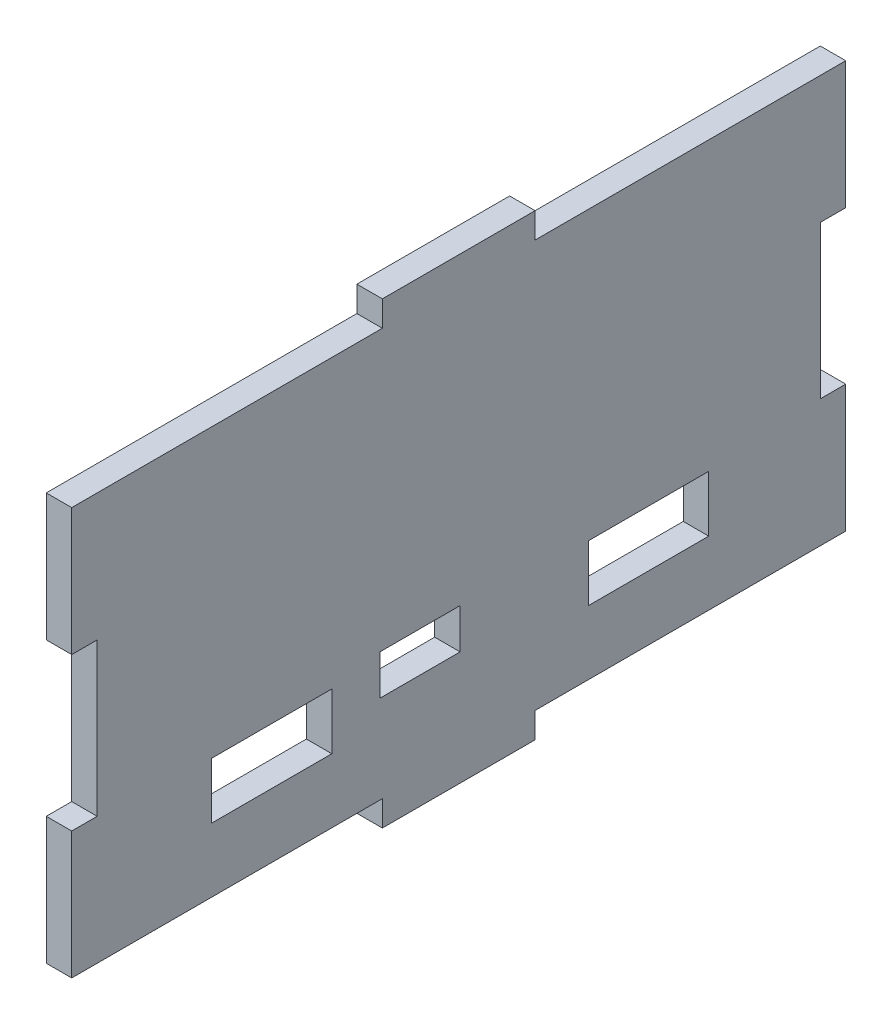
ISO-10303-21;
HEADER;
FILE_DESCRIPTION(('STEP AP214'),'2;1');
FILE_NAME('part.step','',(''),(''),'','','');
FILE_SCHEMA(('AUTOMOTIVE_DESIGN { 1 0 10303 214 1 1 1 1 }'));
ENDSEC;
DATA;
#1=APPLICATION_CONTEXT('core data for automotive mechanical design processes');
#2=APPLICATION_PROTOCOL_DEFINITION('international standard','automotive_design',2000,#1);
#3=PRODUCT_CONTEXT('',#1,'mechanical');
#4=PRODUCT('Part','Part','',(#3));
#5=PRODUCT_RELATED_PRODUCT_CATEGORY('part','',(#4));
#6=PRODUCT_DEFINITION_FORMATION('','',#4);
#7=PRODUCT_DEFINITION_CONTEXT('part definition',#1,'design');
#8=PRODUCT_DEFINITION('design','',#6,#7);
#9=PRODUCT_DEFINITION_SHAPE('','',#8);
#10=(LENGTH_UNIT() NAMED_UNIT(*) SI_UNIT(.MILLI.,.METRE.));
#11=(NAMED_UNIT(*) PLANE_ANGLE_UNIT() SI_UNIT($,.RADIAN.));
#12=(NAMED_UNIT(*) SI_UNIT($,.STERADIAN.) SOLID_ANGLE_UNIT());
#13=UNCERTAINTY_MEASURE_WITH_UNIT(LENGTH_MEASURE(1.E-05),#10,'distance_accuracy_value','');
#14=(GEOMETRIC_REPRESENTATION_CONTEXT(3) GLOBAL_UNCERTAINTY_ASSIGNED_CONTEXT((#13)) GLOBAL_UNIT_ASSIGNED_CONTEXT((#10,
#11,#12)) REPRESENTATION_CONTEXT('',''));
#15=CARTESIAN_POINT('',(0.,0.,0.));
#16=DIRECTION('',(0.,0.,1.));
#17=DIRECTION('',(1.,0.,0.));
#18=AXIS2_PLACEMENT_3D('',#15,#16,#17);
#19=CARTESIAN_POINT('',(3.175,0.,0.));
#20=DIRECTION('',(1.,0.,0.));
#21=DIRECTION('',(0.,0.,-1.));
#22=AXIS2_PLACEMENT_3D('',#19,#20,#21);
#23=PLANE('',#22);
#24=DIRECTION('',(0.,-1.,0.));
#25=VECTOR('',#24,1.);
#26=CARTESIAN_POINT('',(3.175,0.,0.));
#27=LINE('',#26,#25);
#28=CARTESIAN_POINT('',(3.175,15.875,0.));
#29=VERTEX_POINT('',#28);
#30=CARTESIAN_POINT('',(3.175,0.,0.));
#31=VERTEX_POINT('',#30);
#32=EDGE_CURVE('E342',#29,#31,#27,.T.);
#33=ORIENTED_EDGE('',*,*,#32,.T.);
#34=DIRECTION('',(0.,0.,-1.));
#35=VECTOR('',#34,1.);
#36=CARTESIAN_POINT('',(3.175,0.,0.));
#37=LINE('',#36,#35);
#38=CARTESIAN_POINT('',(3.175,0.,-38.735));
#39=VERTEX_POINT('',#38);
#40=EDGE_CURVE('E345',#31,#39,#37,.T.);
#41=ORIENTED_EDGE('',*,*,#40,.T.);
#42=DIRECTION('',(0.,-1.,0.));
#43=VECTOR('',#42,1.);
#44=CARTESIAN_POINT('',(3.175,0.,-38.735));
#45=LINE('',#44,#43);
#46=CARTESIAN_POINT('',(3.175,-3.175,-38.735));
#47=VERTEX_POINT('',#46);
#48=EDGE_CURVE('E348',#39,#47,#45,.T.);
#49=ORIENTED_EDGE('',*,*,#48,.T.);
#50=DIRECTION('',(0.,0.,-1.));
#51=VECTOR('',#50,1.);
#52=CARTESIAN_POINT('',(3.175,-3.175,-38.735));
#53=LINE('',#52,#51);
#54=CARTESIAN_POINT('',(3.175,-3.175,-57.785));
#55=VERTEX_POINT('',#54);
#56=EDGE_CURVE('E350',#47,#55,#53,.T.);
#57=ORIENTED_EDGE('',*,*,#56,.T.);
#58=DIRECTION('',(0.,1.,0.));
#59=VECTOR('',#58,1.);
#60=CARTESIAN_POINT('',(3.175,-3.175,-57.785));
#61=LINE('',#60,#59);
#62=CARTESIAN_POINT('',(3.175,0.,-57.785));
#63=VERTEX_POINT('',#62);
#64=EDGE_CURVE('E352',#55,#63,#61,.T.);
#65=ORIENTED_EDGE('',*,*,#64,.T.);
#66=DIRECTION('',(0.,0.,-1.));
#67=VECTOR('',#66,1.);
#68=CARTESIAN_POINT('',(3.175,0.,-57.785));
#69=LINE('',#68,#67);
#70=CARTESIAN_POINT('',(3.175,0.,-96.52));
#71=VERTEX_POINT('',#70);
#72=EDGE_CURVE('E354',#63,#71,#69,.T.);
#73=ORIENTED_EDGE('',*,*,#72,.T.);
#74=DIRECTION('',(0.,1.,0.));
#75=VECTOR('',#74,1.);
#76=CARTESIAN_POINT('',(3.175,0.,-96.52));
#77=LINE('',#76,#75);
#78=CARTESIAN_POINT('',(3.175,15.875,-96.52));
#79=VERTEX_POINT('',#78);
#80=EDGE_CURVE('E356',#71,#79,#77,.T.);
#81=ORIENTED_EDGE('',*,*,#80,.T.);
#82=DIRECTION('',(0.,0.,1.));
#83=VECTOR('',#82,1.);
#84=CARTESIAN_POINT('',(3.175,15.875,-93.345));
#85=LINE('',#84,#83);
#86=CARTESIAN_POINT('',(3.175,15.875,-93.345));
#87=VERTEX_POINT('',#86);
#88=EDGE_CURVE('E358',#79,#87,#85,.T.);
#89=ORIENTED_EDGE('',*,*,#88,.T.);
#90=DIRECTION('',(0.,1.,0.));
#91=VECTOR('',#90,1.);
#92=CARTESIAN_POINT('',(3.175,34.925,-93.345));
#93=LINE('',#92,#91);
#94=CARTESIAN_POINT('',(3.175,34.925,-93.345));
#95=VERTEX_POINT('',#94);
#96=EDGE_CURVE('E360',#87,#95,#93,.T.);
#97=ORIENTED_EDGE('',*,*,#96,.T.);
#98=DIRECTION('',(0.,0.,-1.));
#99=VECTOR('',#98,1.);
#100=CARTESIAN_POINT('',(3.175,34.925,-96.52));
#101=LINE('',#100,#99);
#102=CARTESIAN_POINT('',(3.175,34.925,-96.52));
#103=VERTEX_POINT('',#102);
#104=EDGE_CURVE('E362',#95,#103,#101,.T.);
#105=ORIENTED_EDGE('',*,*,#104,.T.);
#106=DIRECTION('',(0.,1.,0.));
#107=VECTOR('',#106,1.);
#108=CARTESIAN_POINT('',(3.175,34.925,-96.52));
#109=LINE('',#108,#107);
#110=CARTESIAN_POINT('',(3.175,50.8,-96.52));
#111=VERTEX_POINT('',#110);
#112=EDGE_CURVE('E364',#103,#111,#109,.T.);
#113=ORIENTED_EDGE('',*,*,#112,.T.);
#114=DIRECTION('',(0.,0.,1.));
#115=VECTOR('',#114,1.);
#116=CARTESIAN_POINT('',(3.175,50.8,-57.785));
#117=LINE('',#116,#115);
#118=CARTESIAN_POINT('',(3.175,50.8,-57.785));
#119=VERTEX_POINT('',#118);
#120=EDGE_CURVE('E366',#111,#119,#117,.T.);
#121=ORIENTED_EDGE('',*,*,#120,.T.);
#122=DIRECTION('',(0.,1.,0.));
#123=VECTOR('',#122,1.);
#124=CARTESIAN_POINT('',(3.175,53.975,-57.785));
#125=LINE('',#124,#123);
#126=CARTESIAN_POINT('',(3.175,53.975,-57.785));
#127=VERTEX_POINT('',#126);
#128=EDGE_CURVE('E368',#119,#127,#125,.T.);
#129=ORIENTED_EDGE('',*,*,#128,.T.);
#130=DIRECTION('',(0.,0.,1.));
#131=VECTOR('',#130,1.);
#132=CARTESIAN_POINT('',(3.175,53.975,-38.735));
#133=LINE('',#132,#131);
#134=CARTESIAN_POINT('',(3.175,53.975,-38.735));
#135=VERTEX_POINT('',#134);
#136=EDGE_CURVE('E370',#127,#135,#133,.T.);
#137=ORIENTED_EDGE('',*,*,#136,.T.);
#138=DIRECTION('',(0.,-1.,0.));
#139=VECTOR('',#138,1.);
#140=CARTESIAN_POINT('',(3.175,50.8,-38.735));
#141=LINE('',#140,#139);
#142=CARTESIAN_POINT('',(3.175,50.8,-38.735));
#143=VERTEX_POINT('',#142);
#144=EDGE_CURVE('E372',#135,#143,#141,.T.);
#145=ORIENTED_EDGE('',*,*,#144,.T.);
#146=DIRECTION('',(0.,0.,1.));
#147=VECTOR('',#146,1.);
#148=CARTESIAN_POINT('',(3.175,50.8,0.));
#149=LINE('',#148,#147);
#150=CARTESIAN_POINT('',(3.175,50.8,0.));
#151=VERTEX_POINT('',#150);
#152=EDGE_CURVE('E374',#143,#151,#149,.T.);
#153=ORIENTED_EDGE('',*,*,#152,.T.);
#154=DIRECTION('',(0.,-1.,0.));
#155=VECTOR('',#154,1.);
#156=CARTESIAN_POINT('',(3.175,34.925,0.));
#157=LINE('',#156,#155);
#158=CARTESIAN_POINT('',(3.175,34.925,0.));
#159=VERTEX_POINT('',#158);
#160=EDGE_CURVE('E376',#151,#159,#157,.T.);
#161=ORIENTED_EDGE('',*,*,#160,.T.);
#162=DIRECTION('',(0.,0.,-1.));
#163=VECTOR('',#162,1.);
#164=CARTESIAN_POINT('',(3.175,34.925,0.));
#165=LINE('',#164,#163);
#166=CARTESIAN_POINT('',(3.175,34.925,-3.175));
#167=VERTEX_POINT('',#166);
#168=EDGE_CURVE('E378',#159,#167,#165,.T.);
#169=ORIENTED_EDGE('',*,*,#168,.T.);
#170=DIRECTION('',(0.,-1.,0.));
#171=VECTOR('',#170,1.);
#172=CARTESIAN_POINT('',(3.175,34.925,-3.175));
#173=LINE('',#172,#171);
#174=CARTESIAN_POINT('',(3.175,15.875,-3.175));
#175=VERTEX_POINT('',#174);
#176=EDGE_CURVE('E380',#167,#175,#173,.T.);
#177=ORIENTED_EDGE('',*,*,#176,.T.);
#178=DIRECTION('',(0.,0.,1.));
#179=VECTOR('',#178,1.);
#180=CARTESIAN_POINT('',(3.175,15.875,-3.175));
#181=LINE('',#180,#179);
#182=EDGE_CURVE('E382',#175,#29,#181,.T.);
#183=ORIENTED_EDGE('',*,*,#182,.T.);
#184=EDGE_LOOP('',(#33,#41,#49,#57,#65,#73,#81,#89,#97,#105,#113,#121,#129,#137,#145,#153,#161,
#169,#177,#183));
#185=FACE_BOUND('',#184,.T.);
#186=DIRECTION('',(0.,1.,0.));
#187=VECTOR('',#186,1.);
#188=CARTESIAN_POINT('',(3.175,15.,-32.4354385027087));
#189=LINE('',#188,#187);
#190=CARTESIAN_POINT('',(3.175,8.,-32.4354385027087));
#191=VERTEX_POINT('',#190);
#192=CARTESIAN_POINT('',(3.175,15.,-32.4354385027087));
#193=VERTEX_POINT('',#192);
#194=EDGE_CURVE('E313',#191,#193,#189,.T.);
#195=ORIENTED_EDGE('',*,*,#194,.F.);
#196=DIRECTION('',(0.,0.,-1.));
#197=VECTOR('',#196,1.);
#198=CARTESIAN_POINT('',(3.175,8.,-32.4354385027087));
#199=LINE('',#198,#197);
#200=CARTESIAN_POINT('',(3.175,8.,-17.4354385027087));
#201=VERTEX_POINT('',#200);
#202=EDGE_CURVE('E311',#201,#191,#199,.T.);
#203=ORIENTED_EDGE('',*,*,#202,.F.);
#204=DIRECTION('',(0.,-1.,0.));
#205=VECTOR('',#204,1.);
#206=CARTESIAN_POINT('',(3.175,8.,-17.4354385027087));
#207=LINE('',#206,#205);
#208=CARTESIAN_POINT('',(3.175,15.,-17.4354385027087));
#209=VERTEX_POINT('',#208);
#210=EDGE_CURVE('E319',#209,#201,#207,.T.);
#211=ORIENTED_EDGE('',*,*,#210,.F.);
#212=DIRECTION('',(0.,0.,1.));
#213=VECTOR('',#212,1.);
#214=CARTESIAN_POINT('',(3.175,15.,-17.4354385027087));
#215=LINE('',#214,#213);
#216=EDGE_CURVE('E316',#193,#209,#215,.T.);
#217=ORIENTED_EDGE('',*,*,#216,.F.);
#218=EDGE_LOOP('',(#195,#203,#211,#217));
#219=FACE_BOUND('',#218,.T.);
#220=DIRECTION('',(0.,0.,-1.));
#221=VECTOR('',#220,1.);
#222=CARTESIAN_POINT('',(3.175,11.,-38.4354385027087));
#223=LINE('',#222,#221);
#224=CARTESIAN_POINT('',(3.175,11.,-38.4354385027087));
#225=VERTEX_POINT('',#224);
#226=CARTESIAN_POINT('',(3.175,11.,-48.4354385027087));
#227=VERTEX_POINT('',#226);
#228=EDGE_CURVE('E282',#225,#227,#223,.T.);
#229=ORIENTED_EDGE('',*,*,#228,.F.);
#230=DIRECTION('',(0.,-1.,0.));
#231=VECTOR('',#230,1.);
#232=CARTESIAN_POINT('',(3.175,11.,-38.4354385027087));
#233=LINE('',#232,#231);
#234=CARTESIAN_POINT('',(3.175,16.,-38.4354385027087));
#235=VERTEX_POINT('',#234);
#236=EDGE_CURVE('E280',#235,#225,#233,.T.);
#237=ORIENTED_EDGE('',*,*,#236,.F.);
#238=DIRECTION('',(0.,0.,1.));
#239=VECTOR('',#238,1.);
#240=CARTESIAN_POINT('',(3.175,16.,-38.4354385027087));
#241=LINE('',#240,#239);
#242=CARTESIAN_POINT('',(3.175,16.,-48.4354385027087));
#243=VERTEX_POINT('',#242);
#244=EDGE_CURVE('E288',#243,#235,#241,.T.);
#245=ORIENTED_EDGE('',*,*,#244,.F.);
#246=DIRECTION('',(0.,1.,0.));
#247=VECTOR('',#246,1.);
#248=CARTESIAN_POINT('',(3.175,11.,-48.4354385027087));
#249=LINE('',#248,#247);
#250=EDGE_CURVE('E285',#227,#243,#249,.T.);
#251=ORIENTED_EDGE('',*,*,#250,.F.);
#252=EDGE_LOOP('',(#229,#237,#245,#251));
#253=FACE_BOUND('',#252,.T.);
#254=DIRECTION('',(0.,0.,-1.));
#255=VECTOR('',#254,1.);
#256=CARTESIAN_POINT('',(3.175,8.,-64.4354385027087));
#257=LINE('',#256,#255);
#258=CARTESIAN_POINT('',(3.175,8.,-64.4354385027087));
#259=VERTEX_POINT('',#258);
#260=CARTESIAN_POINT('',(3.175,8.,-79.4354385027087));
#261=VERTEX_POINT('',#260);
#262=EDGE_CURVE('E252',#259,#261,#257,.T.);
#263=ORIENTED_EDGE('',*,*,#262,.F.);
#264=DIRECTION('',(0.,-1.,0.));
#265=VECTOR('',#264,1.);
#266=CARTESIAN_POINT('',(3.175,8.,-64.4354385027087));
#267=LINE('',#266,#265);
#268=CARTESIAN_POINT('',(3.175,15.,-64.4354385027087));
#269=VERTEX_POINT('',#268);
#270=EDGE_CURVE('E244',#269,#259,#267,.T.);
#271=ORIENTED_EDGE('',*,*,#270,.F.);
#272=DIRECTION('',(0.,0.,1.));
#273=VECTOR('',#272,1.);
#274=CARTESIAN_POINT('',(3.175,15.,-64.4354385027087));
#275=LINE('',#274,#273);
#276=CARTESIAN_POINT('',(3.175,15.,-79.4354385027087));
#277=VERTEX_POINT('',#276);
#278=EDGE_CURVE('E266',#277,#269,#275,.T.);
#279=ORIENTED_EDGE('',*,*,#278,.F.);
#280=DIRECTION('',(0.,1.,0.));
#281=VECTOR('',#280,1.);
#282=CARTESIAN_POINT('',(3.175,8.,-79.4354385027087));
#283=LINE('',#282,#281);
#284=EDGE_CURVE('E264',#261,#277,#283,.T.);
#285=ORIENTED_EDGE('',*,*,#284,.F.);
#286=EDGE_LOOP('',(#263,#271,#279,#285));
#287=FACE_BOUND('',#286,.T.);
#288=ADVANCED_FACE('F35',(#185,#219,#253,#287),#23,.T.);
#289=CARTESIAN_POINT('',(0.,0.,0.));
#290=DIRECTION('',(1.,0.,0.));
#291=DIRECTION('',(0.,0.,-1.));
#292=AXIS2_PLACEMENT_3D('',#289,#290,#291);
#293=PLANE('',#292);
#294=DIRECTION('',(0.,-1.,0.));
#295=VECTOR('',#294,1.);
#296=CARTESIAN_POINT('',(0.,11.,-38.4354385027087));
#297=LINE('',#296,#295);
#298=CARTESIAN_POINT('',(0.,16.,-38.4354385027087));
#299=VERTEX_POINT('',#298);
#300=CARTESIAN_POINT('',(0.,11.,-38.4354385027087));
#301=VERTEX_POINT('',#300);
#302=EDGE_CURVE('E260',#299,#301,#297,.T.);
#303=ORIENTED_EDGE('',*,*,#302,.T.);
#304=DIRECTION('',(0.,0.,-1.));
#305=VECTOR('',#304,1.);
#306=CARTESIAN_POINT('',(0.,11.,-38.4354385027087));
#307=LINE('',#306,#305);
#308=CARTESIAN_POINT('',(0.,11.,-48.4354385027087));
#309=VERTEX_POINT('',#308);
#310=EDGE_CURVE('E293',#301,#309,#307,.T.);
#311=ORIENTED_EDGE('',*,*,#310,.T.);
#312=DIRECTION('',(0.,1.,0.));
#313=VECTOR('',#312,1.);
#314=CARTESIAN_POINT('',(0.,11.,-48.4354385027087));
#315=LINE('',#314,#313);
#316=CARTESIAN_POINT('',(0.,16.,-48.4354385027087));
#317=VERTEX_POINT('',#316);
#318=EDGE_CURVE('E296',#309,#317,#315,.T.);
#319=ORIENTED_EDGE('',*,*,#318,.T.);
#320=DIRECTION('',(0.,0.,1.));
#321=VECTOR('',#320,1.);
#322=CARTESIAN_POINT('',(0.,16.,-38.4354385027087));
#323=LINE('',#322,#321);
#324=EDGE_CURVE('E283',#317,#299,#323,.T.);
#325=ORIENTED_EDGE('',*,*,#324,.T.);
#326=EDGE_LOOP('',(#303,#311,#319,#325));
#327=FACE_BOUND('',#326,.T.);
#328=DIRECTION('',(0.,-1.,0.));
#329=VECTOR('',#328,1.);
#330=CARTESIAN_POINT('',(0.,0.,0.));
#331=LINE('',#330,#329);
#332=CARTESIAN_POINT('',(0.,15.875,0.));
#333=VERTEX_POINT('',#332);
#334=CARTESIAN_POINT('',(0.,0.,0.));
#335=VERTEX_POINT('',#334);
#336=EDGE_CURVE('E341',#333,#335,#331,.T.);
#337=ORIENTED_EDGE('',*,*,#336,.F.);
#338=DIRECTION('',(0.,0.,1.));
#339=VECTOR('',#338,1.);
#340=CARTESIAN_POINT('',(0.,15.875,-3.175));
#341=LINE('',#340,#339);
#342=CARTESIAN_POINT('',(0.,15.875,-3.175));
#343=VERTEX_POINT('',#342);
#344=EDGE_CURVE('E346',#343,#333,#341,.T.);
#345=ORIENTED_EDGE('',*,*,#344,.F.);
#346=DIRECTION('',(0.,-1.,0.));
#347=VECTOR('',#346,1.);
#348=CARTESIAN_POINT('',(0.,34.925,-3.175));
#349=LINE('',#348,#347);
#350=CARTESIAN_POINT('',(0.,34.925,-3.175));
#351=VERTEX_POINT('',#350);
#352=EDGE_CURVE('E421',#351,#343,#349,.T.);
#353=ORIENTED_EDGE('',*,*,#352,.F.);
#354=DIRECTION('',(0.,0.,-1.));
#355=VECTOR('',#354,1.);
#356=CARTESIAN_POINT('',(0.,34.925,0.));
#357=LINE('',#356,#355);
#358=CARTESIAN_POINT('',(0.,34.925,0.));
#359=VERTEX_POINT('',#358);
#360=EDGE_CURVE('E419',#359,#351,#357,.T.);
#361=ORIENTED_EDGE('',*,*,#360,.F.);
#362=DIRECTION('',(0.,-1.,0.));
#363=VECTOR('',#362,1.);
#364=CARTESIAN_POINT('',(0.,34.925,0.));
#365=LINE('',#364,#363);
#366=CARTESIAN_POINT('',(0.,50.8,0.));
#367=VERTEX_POINT('',#366);
#368=EDGE_CURVE('E417',#367,#359,#365,.T.);
#369=ORIENTED_EDGE('',*,*,#368,.F.);
#370=DIRECTION('',(0.,0.,1.));
#371=VECTOR('',#370,1.);
#372=CARTESIAN_POINT('',(0.,50.8,0.));
#373=LINE('',#372,#371);
#374=CARTESIAN_POINT('',(0.,50.8,-38.735));
#375=VERTEX_POINT('',#374);
#376=EDGE_CURVE('E415',#375,#367,#373,.T.);
#377=ORIENTED_EDGE('',*,*,#376,.F.);
#378=DIRECTION('',(0.,-1.,0.));
#379=VECTOR('',#378,1.);
#380=CARTESIAN_POINT('',(0.,50.8,-38.735));
#381=LINE('',#380,#379);
#382=CARTESIAN_POINT('',(0.,53.975,-38.735));
#383=VERTEX_POINT('',#382);
#384=EDGE_CURVE('E413',#383,#375,#381,.T.);
#385=ORIENTED_EDGE('',*,*,#384,.F.);
#386=DIRECTION('',(0.,0.,1.));
#387=VECTOR('',#386,1.);
#388=CARTESIAN_POINT('',(0.,53.975,-38.735));
#389=LINE('',#388,#387);
#390=CARTESIAN_POINT('',(0.,53.975,-57.785));
#391=VERTEX_POINT('',#390);
#392=EDGE_CURVE('E411',#391,#383,#389,.T.);
#393=ORIENTED_EDGE('',*,*,#392,.F.);
#394=DIRECTION('',(0.,1.,0.));
#395=VECTOR('',#394,1.);
#396=CARTESIAN_POINT('',(0.,53.975,-57.785));
#397=LINE('',#396,#395);
#398=CARTESIAN_POINT('',(0.,50.8,-57.785));
#399=VERTEX_POINT('',#398);
#400=EDGE_CURVE('E409',#399,#391,#397,.T.);
#401=ORIENTED_EDGE('',*,*,#400,.F.);
#402=DIRECTION('',(0.,0.,1.));
#403=VECTOR('',#402,1.);
#404=CARTESIAN_POINT('',(0.,50.8,-57.785));
#405=LINE('',#404,#403);
#406=CARTESIAN_POINT('',(0.,50.8,-96.52));
#407=VERTEX_POINT('',#406);
#408=EDGE_CURVE('E407',#407,#399,#405,.T.);
#409=ORIENTED_EDGE('',*,*,#408,.F.);
#410=DIRECTION('',(0.,1.,0.));
#411=VECTOR('',#410,1.);
#412=CARTESIAN_POINT('',(0.,34.925,-96.52));
#413=LINE('',#412,#411);
#414=CARTESIAN_POINT('',(0.,34.925,-96.52));
#415=VERTEX_POINT('',#414);
#416=EDGE_CURVE('E405',#415,#407,#413,.T.);
#417=ORIENTED_EDGE('',*,*,#416,.F.);
#418=DIRECTION('',(0.,0.,-1.));
#419=VECTOR('',#418,1.);
#420=CARTESIAN_POINT('',(0.,34.925,-96.52));
#421=LINE('',#420,#419);
#422=CARTESIAN_POINT('',(0.,34.925,-93.345));
#423=VERTEX_POINT('',#422);
#424=EDGE_CURVE('E403',#423,#415,#421,.T.);
#425=ORIENTED_EDGE('',*,*,#424,.F.);
#426=DIRECTION('',(0.,1.,0.));
#427=VECTOR('',#426,1.);
#428=CARTESIAN_POINT('',(0.,34.925,-93.345));
#429=LINE('',#428,#427);
#430=CARTESIAN_POINT('',(0.,15.875,-93.345));
#431=VERTEX_POINT('',#430);
#432=EDGE_CURVE('E401',#431,#423,#429,.T.);
#433=ORIENTED_EDGE('',*,*,#432,.F.);
#434=DIRECTION('',(0.,0.,1.));
#435=VECTOR('',#434,1.);
#436=CARTESIAN_POINT('',(0.,15.875,-93.345));
#437=LINE('',#436,#435);
#438=CARTESIAN_POINT('',(0.,15.875,-96.52));
#439=VERTEX_POINT('',#438);
#440=EDGE_CURVE('E399',#439,#431,#437,.T.);
#441=ORIENTED_EDGE('',*,*,#440,.F.);
#442=DIRECTION('',(0.,1.,0.));
#443=VECTOR('',#442,1.);
#444=CARTESIAN_POINT('',(0.,0.,-96.52));
#445=LINE('',#444,#443);
#446=CARTESIAN_POINT('',(0.,0.,-96.52));
#447=VERTEX_POINT('',#446);
#448=EDGE_CURVE('E397',#447,#439,#445,.T.);
#449=ORIENTED_EDGE('',*,*,#448,.F.);
#450=DIRECTION('',(0.,0.,-1.));
#451=VECTOR('',#450,1.);
#452=CARTESIAN_POINT('',(0.,0.,-57.785));
#453=LINE('',#452,#451);
#454=CARTESIAN_POINT('',(0.,0.,-57.785));
#455=VERTEX_POINT('',#454);
#456=EDGE_CURVE('E395',#455,#447,#453,.T.);
#457=ORIENTED_EDGE('',*,*,#456,.F.);
#458=DIRECTION('',(0.,1.,0.));
#459=VECTOR('',#458,1.);
#460=CARTESIAN_POINT('',(0.,-3.175,-57.785));
#461=LINE('',#460,#459);
#462=CARTESIAN_POINT('',(0.,-3.175,-57.785));
#463=VERTEX_POINT('',#462);
#464=EDGE_CURVE('E393',#463,#455,#461,.T.);
#465=ORIENTED_EDGE('',*,*,#464,.F.);
#466=DIRECTION('',(0.,0.,-1.));
#467=VECTOR('',#466,1.);
#468=CARTESIAN_POINT('',(0.,-3.175,-38.735));
#469=LINE('',#468,#467);
#470=CARTESIAN_POINT('',(0.,-3.175,-38.735));
#471=VERTEX_POINT('',#470);
#472=EDGE_CURVE('E391',#471,#463,#469,.T.);
#473=ORIENTED_EDGE('',*,*,#472,.F.);
#474=DIRECTION('',(0.,-1.,0.));
#475=VECTOR('',#474,1.);
#476=CARTESIAN_POINT('',(0.,0.,-38.735));
#477=LINE('',#476,#475);
#478=CARTESIAN_POINT('',(0.,0.,-38.735));
#479=VERTEX_POINT('',#478);
#480=EDGE_CURVE('E389',#479,#471,#477,.T.);
#481=ORIENTED_EDGE('',*,*,#480,.F.);
#482=DIRECTION('',(0.,0.,-1.));
#483=VECTOR('',#482,1.);
#484=CARTESIAN_POINT('',(0.,0.,0.));
#485=LINE('',#484,#483);
#486=EDGE_CURVE('E387',#335,#479,#485,.T.);
#487=ORIENTED_EDGE('',*,*,#486,.F.);
#488=EDGE_LOOP('',(#337,#345,#353,#361,#369,#377,#385,#393,#401,#409,#417,#425,#433,#441,#449,
#457,#465,#473,#481,#487));
#489=FACE_BOUND('',#488,.T.);
#490=DIRECTION('',(0.,0.,-1.));
#491=VECTOR('',#490,1.);
#492=CARTESIAN_POINT('',(0.,8.,-32.4354385027087));
#493=LINE('',#492,#491);
#494=CARTESIAN_POINT('',(0.,8.,-17.4354385027087));
#495=VERTEX_POINT('',#494);
#496=CARTESIAN_POINT('',(0.,8.,-32.4354385027087));
#497=VERTEX_POINT('',#496);
#498=EDGE_CURVE('E310',#495,#497,#493,.T.);
#499=ORIENTED_EDGE('',*,*,#498,.T.);
#500=DIRECTION('',(0.,1.,0.));
#501=VECTOR('',#500,1.);
#502=CARTESIAN_POINT('',(0.,15.,-32.4354385027087));
#503=LINE('',#502,#501);
#504=CARTESIAN_POINT('',(0.,15.,-32.4354385027087));
#505=VERTEX_POINT('',#504);
#506=EDGE_CURVE('E324',#497,#505,#503,.T.);
#507=ORIENTED_EDGE('',*,*,#506,.T.);
#508=DIRECTION('',(0.,0.,1.));
#509=VECTOR('',#508,1.);
#510=CARTESIAN_POINT('',(0.,15.,-17.4354385027087));
#511=LINE('',#510,#509);
#512=CARTESIAN_POINT('',(0.,15.,-17.4354385027087));
#513=VERTEX_POINT('',#512);
#514=EDGE_CURVE('E327',#505,#513,#511,.T.);
#515=ORIENTED_EDGE('',*,*,#514,.T.);
#516=DIRECTION('',(0.,-1.,0.));
#517=VECTOR('',#516,1.);
#518=CARTESIAN_POINT('',(0.,8.,-17.4354385027087));
#519=LINE('',#518,#517);
#520=EDGE_CURVE('E314',#513,#495,#519,.T.);
#521=ORIENTED_EDGE('',*,*,#520,.T.);
#522=EDGE_LOOP('',(#499,#507,#515,#521));
#523=FACE_BOUND('',#522,.T.);
#524=DIRECTION('',(0.,-1.,0.));
#525=VECTOR('',#524,1.);
#526=CARTESIAN_POINT('',(0.,8.,-64.4354385027087));
#527=LINE('',#526,#525);
#528=CARTESIAN_POINT('',(0.,15.,-64.4354385027087));
#529=VERTEX_POINT('',#528);
#530=CARTESIAN_POINT('',(0.,8.,-64.4354385027087));
#531=VERTEX_POINT('',#530);
#532=EDGE_CURVE('E58',#529,#531,#527,.T.);
#533=ORIENTED_EDGE('',*,*,#532,.T.);
#534=DIRECTION('',(0.,0.,-1.));
#535=VECTOR('',#534,1.);
#536=CARTESIAN_POINT('',(0.,8.,-64.4354385027087));
#537=LINE('',#536,#535);
#538=CARTESIAN_POINT('',(0.,8.,-79.4354385027087));
#539=VERTEX_POINT('',#538);
#540=EDGE_CURVE('E259',#531,#539,#537,.T.);
#541=ORIENTED_EDGE('',*,*,#540,.T.);
#542=DIRECTION('',(0.,1.,0.));
#543=VECTOR('',#542,1.);
#544=CARTESIAN_POINT('',(0.,8.,-79.4354385027087));
#545=LINE('',#544,#543);
#546=CARTESIAN_POINT('',(0.,15.,-79.4354385027087));
#547=VERTEX_POINT('',#546);
#548=EDGE_CURVE('E272',#539,#547,#545,.T.);
#549=ORIENTED_EDGE('',*,*,#548,.T.);
#550=DIRECTION('',(0.,0.,1.));
#551=VECTOR('',#550,1.);
#552=CARTESIAN_POINT('',(0.,15.,-64.4354385027087));
#553=LINE('',#552,#551);
#554=EDGE_CURVE('E253',#547,#529,#553,.T.);
#555=ORIENTED_EDGE('',*,*,#554,.T.);
#556=EDGE_LOOP('',(#533,#541,#549,#555));
#557=FACE_BOUND('',#556,.T.);
#558=ADVANCED_FACE('F487',(#327,#489,#523,#557),#293,.F.);
#559=CARTESIAN_POINT('',(3.175,0.,0.));
#560=DIRECTION('',(0.,0.,-1.));
#561=DIRECTION('',(-1.,0.,0.));
#562=AXIS2_PLACEMENT_3D('',#559,#560,#561);
#563=PLANE('',#562);
#564=ORIENTED_EDGE('',*,*,#336,.T.);
#565=DIRECTION('',(-1.,0.,0.));
#566=VECTOR('',#565,1.);
#567=CARTESIAN_POINT('',(3.175,0.,0.));
#568=LINE('',#567,#566);
#569=EDGE_CURVE('E11',#31,#335,#568,.T.);
#570=ORIENTED_EDGE('',*,*,#569,.F.);
#571=ORIENTED_EDGE('',*,*,#32,.F.);
#572=DIRECTION('',(-1.,0.,0.));
#573=VECTOR('',#572,1.);
#574=CARTESIAN_POINT('',(3.175,15.875,0.));
#575=LINE('',#574,#573);
#576=EDGE_CURVE('E384',#29,#333,#575,.T.);
#577=ORIENTED_EDGE('',*,*,#576,.T.);
#578=EDGE_LOOP('',(#564,#570,#571,#577));
#579=FACE_BOUND('',#578,.T.);
#580=ADVANCED_FACE('F37',(#579),#563,.F.);
#581=CARTESIAN_POINT('',(3.175,0.,0.));
#582=DIRECTION('',(0.,1.,0.));
#583=DIRECTION('',(0.,0.,1.));
#584=AXIS2_PLACEMENT_3D('',#581,#582,#583);
#585=PLANE('',#584);
#586=ORIENTED_EDGE('',*,*,#486,.T.);
#587=DIRECTION('',(-1.,0.,0.));
#588=VECTOR('',#587,1.);
#589=CARTESIAN_POINT('',(3.175,0.,-38.735));
#590=LINE('',#589,#588);
#591=EDGE_CURVE('E43',#39,#479,#590,.T.);
#592=ORIENTED_EDGE('',*,*,#591,.F.);
#593=ORIENTED_EDGE('',*,*,#40,.F.);
#594=ORIENTED_EDGE('',*,*,#569,.T.);
#595=EDGE_LOOP('',(#586,#592,#593,#594));
#596=FACE_BOUND('',#595,.T.);
#597=ADVANCED_FACE('F505',(#596),#585,.F.);
#598=CARTESIAN_POINT('',(3.175,0.,-38.735));
#599=DIRECTION('',(0.,0.,-1.));
#600=DIRECTION('',(-1.,0.,0.));
#601=AXIS2_PLACEMENT_3D('',#598,#599,#600);
#602=PLANE('',#601);
#603=ORIENTED_EDGE('',*,*,#480,.T.);
#604=DIRECTION('',(-1.,0.,0.));
#605=VECTOR('',#604,1.);
#606=CARTESIAN_POINT('',(3.175,-3.175,-38.735));
#607=LINE('',#606,#605);
#608=EDGE_CURVE('E474',#47,#471,#607,.T.);
#609=ORIENTED_EDGE('',*,*,#608,.F.);
#610=ORIENTED_EDGE('',*,*,#48,.F.);
#611=ORIENTED_EDGE('',*,*,#591,.T.);
#612=EDGE_LOOP('',(#603,#609,#610,#611));
#613=FACE_BOUND('',#612,.T.);
#614=ADVANCED_FACE('F481',(#613),#602,.F.);
#615=CARTESIAN_POINT('',(3.175,-3.175,-38.735));
#616=DIRECTION('',(0.,1.,0.));
#617=DIRECTION('',(0.,0.,1.));
#618=AXIS2_PLACEMENT_3D('',#615,#616,#617);
#619=PLANE('',#618);
#620=ORIENTED_EDGE('',*,*,#472,.T.);
#621=DIRECTION('',(-1.,0.,0.));
#622=VECTOR('',#621,1.);
#623=CARTESIAN_POINT('',(3.175,-3.175,-57.785));
#624=LINE('',#623,#622);
#625=EDGE_CURVE('E471',#55,#463,#624,.T.);
#626=ORIENTED_EDGE('',*,*,#625,.F.);
#627=ORIENTED_EDGE('',*,*,#56,.F.);
#628=ORIENTED_EDGE('',*,*,#608,.T.);
#629=EDGE_LOOP('',(#620,#626,#627,#628));
#630=FACE_BOUND('',#629,.T.);
#631=ADVANCED_FACE('F493',(#630),#619,.F.);
#632=CARTESIAN_POINT('',(3.175,-3.175,-57.785));
#633=DIRECTION('',(0.,0.,1.));
#634=DIRECTION('',(1.,0.,0.));
#635=AXIS2_PLACEMENT_3D('',#632,#633,#634);
#636=PLANE('',#635);
#637=ORIENTED_EDGE('',*,*,#464,.T.);
#638=DIRECTION('',(-1.,0.,0.));
#639=VECTOR('',#638,1.);
#640=CARTESIAN_POINT('',(3.175,0.,-57.785));
#641=LINE('',#640,#639);
#642=EDGE_CURVE('E468',#63,#455,#641,.T.);
#643=ORIENTED_EDGE('',*,*,#642,.F.);
#644=ORIENTED_EDGE('',*,*,#64,.F.);
#645=ORIENTED_EDGE('',*,*,#625,.T.);
#646=EDGE_LOOP('',(#637,#643,#644,#645));
#647=FACE_BOUND('',#646,.T.);
#648=ADVANCED_FACE('F497',(#647),#636,.F.);
#649=CARTESIAN_POINT('',(3.175,0.,-57.785));
#650=DIRECTION('',(0.,1.,0.));
#651=DIRECTION('',(0.,0.,1.));
#652=AXIS2_PLACEMENT_3D('',#649,#650,#651);
#653=PLANE('',#652);
#654=ORIENTED_EDGE('',*,*,#456,.T.);
#655=DIRECTION('',(-1.,0.,0.));
#656=VECTOR('',#655,1.);
#657=CARTESIAN_POINT('',(3.175,0.,-96.52));
#658=LINE('',#657,#656);
#659=EDGE_CURVE('E465',#71,#447,#658,.T.);
#660=ORIENTED_EDGE('',*,*,#659,.F.);
#661=ORIENTED_EDGE('',*,*,#72,.F.);
#662=ORIENTED_EDGE('',*,*,#642,.T.);
#663=EDGE_LOOP('',(#654,#660,#661,#662));
#664=FACE_BOUND('',#663,.T.);
#665=ADVANCED_FACE('F578',(#664),#653,.F.);
#666=CARTESIAN_POINT('',(3.175,0.,-96.52));
#667=DIRECTION('',(0.,0.,1.));
#668=DIRECTION('',(1.,0.,0.));
#669=AXIS2_PLACEMENT_3D('',#666,#667,#668);
#670=PLANE('',#669);
#671=ORIENTED_EDGE('',*,*,#448,.T.);
#672=DIRECTION('',(-1.,0.,0.));
#673=VECTOR('',#672,1.);
#674=CARTESIAN_POINT('',(3.175,15.875,-96.52));
#675=LINE('',#674,#673);
#676=EDGE_CURVE('E462',#79,#439,#675,.T.);
#677=ORIENTED_EDGE('',*,*,#676,.F.);
#678=ORIENTED_EDGE('',*,*,#80,.F.);
#679=ORIENTED_EDGE('',*,*,#659,.T.);
#680=EDGE_LOOP('',(#671,#677,#678,#679));
#681=FACE_BOUND('',#680,.T.);
#682=ADVANCED_FACE('F576',(#681),#670,.F.);
#683=CARTESIAN_POINT('',(3.175,15.875,-93.345));
#684=DIRECTION('',(0.,-1.,0.));
#685=DIRECTION('',(0.,0.,-1.));
#686=AXIS2_PLACEMENT_3D('',#683,#684,#685);
#687=PLANE('',#686);
#688=ORIENTED_EDGE('',*,*,#440,.T.);
#689=DIRECTION('',(-1.,0.,0.));
#690=VECTOR('',#689,1.);
#691=CARTESIAN_POINT('',(3.175,15.875,-93.345));
#692=LINE('',#691,#690);
#693=EDGE_CURVE('E459',#87,#431,#692,.T.);
#694=ORIENTED_EDGE('',*,*,#693,.F.);
#695=ORIENTED_EDGE('',*,*,#88,.F.);
#696=ORIENTED_EDGE('',*,*,#676,.T.);
#697=EDGE_LOOP('',(#688,#694,#695,#696));
#698=FACE_BOUND('',#697,.T.);
#699=ADVANCED_FACE('F571',(#698),#687,.F.);
#700=CARTESIAN_POINT('',(3.175,34.925,-93.345));
#701=DIRECTION('',(0.,0.,1.));
#702=DIRECTION('',(0.,-1.,0.));
#703=AXIS2_PLACEMENT_3D('',#700,#701,#702);
#704=PLANE('',#703);
#705=ORIENTED_EDGE('',*,*,#432,.T.);
#706=DIRECTION('',(-1.,0.,0.));
#707=VECTOR('',#706,1.);
#708=CARTESIAN_POINT('',(3.175,34.925,-93.345));
#709=LINE('',#708,#707);
#710=EDGE_CURVE('E456',#95,#423,#709,.T.);
#711=ORIENTED_EDGE('',*,*,#710,.F.);
#712=ORIENTED_EDGE('',*,*,#96,.F.);
#713=ORIENTED_EDGE('',*,*,#693,.T.);
#714=EDGE_LOOP('',(#705,#711,#712,#713));
#715=FACE_BOUND('',#714,.T.);
#716=ADVANCED_FACE('F566',(#715),#704,.F.);
#717=CARTESIAN_POINT('',(3.175,34.925,-96.52));
#718=DIRECTION('',(0.,1.,0.));
#719=DIRECTION('',(0.,0.,1.));
#720=AXIS2_PLACEMENT_3D('',#717,#718,#719);
#721=PLANE('',#720);
#722=ORIENTED_EDGE('',*,*,#424,.T.);
#723=DIRECTION('',(-1.,0.,0.));
#724=VECTOR('',#723,1.);
#725=CARTESIAN_POINT('',(3.175,34.925,-96.52));
#726=LINE('',#725,#724);
#727=EDGE_CURVE('E453',#103,#415,#726,.T.);
#728=ORIENTED_EDGE('',*,*,#727,.F.);
#729=ORIENTED_EDGE('',*,*,#104,.F.);
#730=ORIENTED_EDGE('',*,*,#710,.T.);
#731=EDGE_LOOP('',(#722,#728,#729,#730));
#732=FACE_BOUND('',#731,.T.);
#733=ADVANCED_FACE('F562',(#732),#721,.F.);
#734=CARTESIAN_POINT('',(3.175,34.925,-96.52));
#735=DIRECTION('',(0.,0.,1.));
#736=DIRECTION('',(0.,-1.,0.));
#737=AXIS2_PLACEMENT_3D('',#734,#735,#736);
#738=PLANE('',#737);
#739=ORIENTED_EDGE('',*,*,#416,.T.);
#740=DIRECTION('',(-1.,0.,0.));
#741=VECTOR('',#740,1.);
#742=CARTESIAN_POINT('',(3.175,50.8,-96.52));
#743=LINE('',#742,#741);
#744=EDGE_CURVE('E450',#111,#407,#743,.T.);
#745=ORIENTED_EDGE('',*,*,#744,.F.);
#746=ORIENTED_EDGE('',*,*,#112,.F.);
#747=ORIENTED_EDGE('',*,*,#727,.T.);
#748=EDGE_LOOP('',(#739,#745,#746,#747));
#749=FACE_BOUND('',#748,.T.);
#750=ADVANCED_FACE('F557',(#749),#738,.F.);
#751=CARTESIAN_POINT('',(3.175,50.8,-57.785));
#752=DIRECTION('',(0.,-1.,0.));
#753=DIRECTION('',(0.,0.,-1.));
#754=AXIS2_PLACEMENT_3D('',#751,#752,#753);
#755=PLANE('',#754);
#756=ORIENTED_EDGE('',*,*,#408,.T.);
#757=DIRECTION('',(-1.,0.,0.));
#758=VECTOR('',#757,1.);
#759=CARTESIAN_POINT('',(3.175,50.8,-57.785));
#760=LINE('',#759,#758);
#761=EDGE_CURVE('E447',#119,#399,#760,.T.);
#762=ORIENTED_EDGE('',*,*,#761,.F.);
#763=ORIENTED_EDGE('',*,*,#120,.F.);
#764=ORIENTED_EDGE('',*,*,#744,.T.);
#765=EDGE_LOOP('',(#756,#762,#763,#764));
#766=FACE_BOUND('',#765,.T.);
#767=ADVANCED_FACE('F551',(#766),#755,.F.);
#768=CARTESIAN_POINT('',(3.175,53.975,-57.785));
#769=DIRECTION('',(0.,0.,1.));
#770=DIRECTION('',(1.,0.,0.));
#771=AXIS2_PLACEMENT_3D('',#768,#769,#770);
#772=PLANE('',#771);
#773=ORIENTED_EDGE('',*,*,#400,.T.);
#774=DIRECTION('',(-1.,0.,0.));
#775=VECTOR('',#774,1.);
#776=CARTESIAN_POINT('',(3.175,53.975,-57.785));
#777=LINE('',#776,#775);
#778=EDGE_CURVE('E444',#127,#391,#777,.T.);
#779=ORIENTED_EDGE('',*,*,#778,.F.);
#780=ORIENTED_EDGE('',*,*,#128,.F.);
#781=ORIENTED_EDGE('',*,*,#761,.T.);
#782=EDGE_LOOP('',(#773,#779,#780,#781));
#783=FACE_BOUND('',#782,.T.);
#784=ADVANCED_FACE('F547',(#783),#772,.F.);
#785=CARTESIAN_POINT('',(3.175,53.975,-38.735));
#786=DIRECTION('',(0.,-1.,0.));
#787=DIRECTION('',(0.,0.,-1.));
#788=AXIS2_PLACEMENT_3D('',#785,#786,#787);
#789=PLANE('',#788);
#790=ORIENTED_EDGE('',*,*,#392,.T.);
#791=DIRECTION('',(-1.,0.,0.));
#792=VECTOR('',#791,1.);
#793=CARTESIAN_POINT('',(3.175,53.975,-38.735));
#794=LINE('',#793,#792);
#795=EDGE_CURVE('E441',#135,#383,#794,.T.);
#796=ORIENTED_EDGE('',*,*,#795,.F.);
#797=ORIENTED_EDGE('',*,*,#136,.F.);
#798=ORIENTED_EDGE('',*,*,#778,.T.);
#799=EDGE_LOOP('',(#790,#796,#797,#798));
#800=FACE_BOUND('',#799,.T.);
#801=ADVANCED_FACE('F542',(#800),#789,.F.);
#802=CARTESIAN_POINT('',(3.175,50.8,-38.735));
#803=DIRECTION('',(0.,0.,-1.));
#804=DIRECTION('',(-1.,0.,0.));
#805=AXIS2_PLACEMENT_3D('',#802,#803,#804);
#806=PLANE('',#805);
#807=ORIENTED_EDGE('',*,*,#384,.T.);
#808=DIRECTION('',(-1.,0.,0.));
#809=VECTOR('',#808,1.);
#810=CARTESIAN_POINT('',(3.175,50.8,-38.735));
#811=LINE('',#810,#809);
#812=EDGE_CURVE('E438',#143,#375,#811,.T.);
#813=ORIENTED_EDGE('',*,*,#812,.F.);
#814=ORIENTED_EDGE('',*,*,#144,.F.);
#815=ORIENTED_EDGE('',*,*,#795,.T.);
#816=EDGE_LOOP('',(#807,#813,#814,#815));
#817=FACE_BOUND('',#816,.T.);
#818=ADVANCED_FACE('F536',(#817),#806,.F.);
#819=CARTESIAN_POINT('',(3.175,50.8,0.));
#820=DIRECTION('',(0.,-1.,0.));
#821=DIRECTION('',(0.,0.,-1.));
#822=AXIS2_PLACEMENT_3D('',#819,#820,#821);
#823=PLANE('',#822);
#824=ORIENTED_EDGE('',*,*,#376,.T.);
#825=DIRECTION('',(-1.,0.,0.));
#826=VECTOR('',#825,1.);
#827=CARTESIAN_POINT('',(3.175,50.8,0.));
#828=LINE('',#827,#826);
#829=EDGE_CURVE('E435',#151,#367,#828,.T.);
#830=ORIENTED_EDGE('',*,*,#829,.F.);
#831=ORIENTED_EDGE('',*,*,#152,.F.);
#832=ORIENTED_EDGE('',*,*,#812,.T.);
#833=EDGE_LOOP('',(#824,#830,#831,#832));
#834=FACE_BOUND('',#833,.T.);
#835=ADVANCED_FACE('F532',(#834),#823,.F.);
#836=CARTESIAN_POINT('',(3.175,34.925,0.));
#837=DIRECTION('',(0.,0.,-1.));
#838=DIRECTION('',(-1.,0.,0.));
#839=AXIS2_PLACEMENT_3D('',#836,#837,#838);
#840=PLANE('',#839);
#841=ORIENTED_EDGE('',*,*,#368,.T.);
#842=DIRECTION('',(-1.,0.,0.));
#843=VECTOR('',#842,1.);
#844=CARTESIAN_POINT('',(3.175,34.925,0.));
#845=LINE('',#844,#843);
#846=EDGE_CURVE('E432',#159,#359,#845,.T.);
#847=ORIENTED_EDGE('',*,*,#846,.F.);
#848=ORIENTED_EDGE('',*,*,#160,.F.);
#849=ORIENTED_EDGE('',*,*,#829,.T.);
#850=EDGE_LOOP('',(#841,#847,#848,#849));
#851=FACE_BOUND('',#850,.T.);
#852=ADVANCED_FACE('F527',(#851),#840,.F.);
#853=CARTESIAN_POINT('',(3.175,34.925,0.));
#854=DIRECTION('',(0.,1.,0.));
#855=DIRECTION('',(0.,0.,1.));
#856=AXIS2_PLACEMENT_3D('',#853,#854,#855);
#857=PLANE('',#856);
#858=ORIENTED_EDGE('',*,*,#360,.T.);
#859=DIRECTION('',(-1.,0.,0.));
#860=VECTOR('',#859,1.);
#861=CARTESIAN_POINT('',(3.175,34.925,-3.175));
#862=LINE('',#861,#860);
#863=EDGE_CURVE('E429',#167,#351,#862,.T.);
#864=ORIENTED_EDGE('',*,*,#863,.F.);
#865=ORIENTED_EDGE('',*,*,#168,.F.);
#866=ORIENTED_EDGE('',*,*,#846,.T.);
#867=EDGE_LOOP('',(#858,#864,#865,#866));
#868=FACE_BOUND('',#867,.T.);
#869=ADVANCED_FACE('F521',(#868),#857,.F.);
#870=CARTESIAN_POINT('',(3.175,34.925,-3.175));
#871=DIRECTION('',(0.,0.,-1.));
#872=DIRECTION('',(-1.,0.,0.));
#873=AXIS2_PLACEMENT_3D('',#870,#871,#872);
#874=PLANE('',#873);
#875=ORIENTED_EDGE('',*,*,#352,.T.);
#876=DIRECTION('',(-1.,0.,0.));
#877=VECTOR('',#876,1.);
#878=CARTESIAN_POINT('',(3.175,15.875,-3.175));
#879=LINE('',#878,#877);
#880=EDGE_CURVE('E426',#175,#343,#879,.T.);
#881=ORIENTED_EDGE('',*,*,#880,.F.);
#882=ORIENTED_EDGE('',*,*,#176,.F.);
#883=ORIENTED_EDGE('',*,*,#863,.T.);
#884=EDGE_LOOP('',(#875,#881,#882,#883));
#885=FACE_BOUND('',#884,.T.);
#886=ADVANCED_FACE('F517',(#885),#874,.F.);
#887=CARTESIAN_POINT('',(3.175,15.875,-3.175));
#888=DIRECTION('',(0.,-1.,0.));
#889=DIRECTION('',(0.,0.,-1.));
#890=AXIS2_PLACEMENT_3D('',#887,#888,#889);
#891=PLANE('',#890);
#892=ORIENTED_EDGE('',*,*,#344,.T.);
#893=ORIENTED_EDGE('',*,*,#576,.F.);
#894=ORIENTED_EDGE('',*,*,#182,.F.);
#895=ORIENTED_EDGE('',*,*,#880,.T.);
#896=EDGE_LOOP('',(#892,#893,#894,#895));
#897=FACE_BOUND('',#896,.T.);
#898=ADVANCED_FACE('F512',(#897),#891,.F.);
#899=CARTESIAN_POINT('',(3.175,8.,-32.4354385027087));
#900=DIRECTION('',(0.,1.,0.));
#901=DIRECTION('',(0.,0.,1.));
#902=AXIS2_PLACEMENT_3D('',#899,#900,#901);
#903=PLANE('',#902);
#904=ORIENTED_EDGE('',*,*,#498,.F.);
#905=DIRECTION('',(-1.,0.,0.));
#906=VECTOR('',#905,1.);
#907=CARTESIAN_POINT('',(3.175,8.,-17.4354385027087));
#908=LINE('',#907,#906);
#909=EDGE_CURVE('E321',#201,#495,#908,.T.);
#910=ORIENTED_EDGE('',*,*,#909,.F.);
#911=ORIENTED_EDGE('',*,*,#202,.T.);
#912=DIRECTION('',(-1.,0.,0.));
#913=VECTOR('',#912,1.);
#914=CARTESIAN_POINT('',(3.175,8.,-32.4354385027087));
#915=LINE('',#914,#913);
#916=EDGE_CURVE('E338',#191,#497,#915,.T.);
#917=ORIENTED_EDGE('',*,*,#916,.T.);
#918=EDGE_LOOP('',(#904,#910,#911,#917));
#919=FACE_BOUND('',#918,.T.);
#920=ADVANCED_FACE('F595',(#919),#903,.T.);
#921=CARTESIAN_POINT('',(3.175,15.,-32.4354385027087));
#922=DIRECTION('',(0.,0.,1.));
#923=DIRECTION('',(1.,0.,0.));
#924=AXIS2_PLACEMENT_3D('',#921,#922,#923);
#925=PLANE('',#924);
#926=ORIENTED_EDGE('',*,*,#506,.F.);
#927=ORIENTED_EDGE('',*,*,#916,.F.);
#928=ORIENTED_EDGE('',*,*,#194,.T.);
#929=DIRECTION('',(-1.,0.,0.));
#930=VECTOR('',#929,1.);
#931=CARTESIAN_POINT('',(3.175,15.,-32.4354385027087));
#932=LINE('',#931,#930);
#933=EDGE_CURVE('E336',#193,#505,#932,.T.);
#934=ORIENTED_EDGE('',*,*,#933,.T.);
#935=EDGE_LOOP('',(#926,#927,#928,#934));
#936=FACE_BOUND('',#935,.T.);
#937=ADVANCED_FACE('F681',(#936),#925,.T.);
#938=CARTESIAN_POINT('',(3.175,15.,-17.4354385027087));
#939=DIRECTION('',(0.,-1.,0.));
#940=DIRECTION('',(0.,0.,-1.));
#941=AXIS2_PLACEMENT_3D('',#938,#939,#940);
#942=PLANE('',#941);
#943=ORIENTED_EDGE('',*,*,#514,.F.);
#944=ORIENTED_EDGE('',*,*,#933,.F.);
#945=ORIENTED_EDGE('',*,*,#216,.T.);
#946=DIRECTION('',(-1.,0.,0.));
#947=VECTOR('',#946,1.);
#948=CARTESIAN_POINT('',(3.175,15.,-17.4354385027087));
#949=LINE('',#948,#947);
#950=EDGE_CURVE('E334',#209,#513,#949,.T.);
#951=ORIENTED_EDGE('',*,*,#950,.T.);
#952=EDGE_LOOP('',(#943,#944,#945,#951));
#953=FACE_BOUND('',#952,.T.);
#954=ADVANCED_FACE('F688',(#953),#942,.T.);
#955=CARTESIAN_POINT('',(3.175,8.,-17.4354385027087));
#956=DIRECTION('',(0.,0.,-1.));
#957=DIRECTION('',(-1.,0.,0.));
#958=AXIS2_PLACEMENT_3D('',#955,#956,#957);
#959=PLANE('',#958);
#960=ORIENTED_EDGE('',*,*,#520,.F.);
#961=ORIENTED_EDGE('',*,*,#950,.F.);
#962=ORIENTED_EDGE('',*,*,#210,.T.);
#963=ORIENTED_EDGE('',*,*,#909,.T.);
#964=EDGE_LOOP('',(#960,#961,#962,#963));
#965=FACE_BOUND('',#964,.T.);
#966=ADVANCED_FACE('F695',(#965),#959,.T.);
#967=CARTESIAN_POINT('',(3.175,11.,-38.4354385027087));
#968=DIRECTION('',(0.,0.,-1.));
#969=DIRECTION('',(-1.,0.,0.));
#970=AXIS2_PLACEMENT_3D('',#967,#968,#969);
#971=PLANE('',#970);
#972=ORIENTED_EDGE('',*,*,#302,.F.);
#973=DIRECTION('',(-1.,0.,0.));
#974=VECTOR('',#973,1.);
#975=CARTESIAN_POINT('',(3.175,16.,-38.4354385027087));
#976=LINE('',#975,#974);
#977=EDGE_CURVE('E290',#235,#299,#976,.T.);
#978=ORIENTED_EDGE('',*,*,#977,.F.);
#979=ORIENTED_EDGE('',*,*,#236,.T.);
#980=DIRECTION('',(-1.,0.,0.));
#981=VECTOR('',#980,1.);
#982=CARTESIAN_POINT('',(3.175,11.,-38.4354385027087));
#983=LINE('',#982,#981);
#984=EDGE_CURVE('E307',#225,#301,#983,.T.);
#985=ORIENTED_EDGE('',*,*,#984,.T.);
#986=EDGE_LOOP('',(#972,#978,#979,#985));
#987=FACE_BOUND('',#986,.T.);
#988=ADVANCED_FACE('F703',(#987),#971,.T.);
#989=CARTESIAN_POINT('',(3.175,11.,-38.4354385027087));
#990=DIRECTION('',(0.,1.,0.));
#991=DIRECTION('',(0.,0.,1.));
#992=AXIS2_PLACEMENT_3D('',#989,#990,#991);
#993=PLANE('',#992);
#994=ORIENTED_EDGE('',*,*,#310,.F.);
#995=ORIENTED_EDGE('',*,*,#984,.F.);
#996=ORIENTED_EDGE('',*,*,#228,.T.);
#997=DIRECTION('',(-1.,0.,0.));
#998=VECTOR('',#997,1.);
#999=CARTESIAN_POINT('',(3.175,11.,-48.4354385027087));
#1000=LINE('',#999,#998);
#1001=EDGE_CURVE('E305',#227,#309,#1000,.T.);
#1002=ORIENTED_EDGE('',*,*,#1001,.T.);
#1003=EDGE_LOOP('',(#994,#995,#996,#1002));
#1004=FACE_BOUND('',#1003,.T.);
#1005=ADVANCED_FACE('F711',(#1004),#993,.T.);
#1006=CARTESIAN_POINT('',(3.175,11.,-48.4354385027087));
#1007=DIRECTION('',(0.,0.,1.));
#1008=DIRECTION('',(1.,0.,0.));
#1009=AXIS2_PLACEMENT_3D('',#1006,#1007,#1008);
#1010=PLANE('',#1009);
#1011=ORIENTED_EDGE('',*,*,#318,.F.);
#1012=ORIENTED_EDGE('',*,*,#1001,.F.);
#1013=ORIENTED_EDGE('',*,*,#250,.T.);
#1014=DIRECTION('',(-1.,0.,0.));
#1015=VECTOR('',#1014,1.);
#1016=CARTESIAN_POINT('',(3.175,16.,-48.4354385027087));
#1017=LINE('',#1016,#1015);
#1018=EDGE_CURVE('E303',#243,#317,#1017,.T.);
#1019=ORIENTED_EDGE('',*,*,#1018,.T.);
#1020=EDGE_LOOP('',(#1011,#1012,#1013,#1019));
#1021=FACE_BOUND('',#1020,.T.);
#1022=ADVANCED_FACE('F719',(#1021),#1010,.T.);
#1023=CARTESIAN_POINT('',(3.175,16.,-38.4354385027087));
#1024=DIRECTION('',(0.,-1.,0.));
#1025=DIRECTION('',(0.,0.,-1.));
#1026=AXIS2_PLACEMENT_3D('',#1023,#1024,#1025);
#1027=PLANE('',#1026);
#1028=ORIENTED_EDGE('',*,*,#324,.F.);
#1029=ORIENTED_EDGE('',*,*,#1018,.F.);
#1030=ORIENTED_EDGE('',*,*,#244,.T.);
#1031=ORIENTED_EDGE('',*,*,#977,.T.);
#1032=EDGE_LOOP('',(#1028,#1029,#1030,#1031));
#1033=FACE_BOUND('',#1032,.T.);
#1034=ADVANCED_FACE('F727',(#1033),#1027,.T.);
#1035=CARTESIAN_POINT('',(3.175,8.,-64.4354385027087));
#1036=DIRECTION('',(0.,0.,-1.));
#1037=DIRECTION('',(-1.,0.,0.));
#1038=AXIS2_PLACEMENT_3D('',#1035,#1036,#1037);
#1039=PLANE('',#1038);
#1040=ORIENTED_EDGE('',*,*,#532,.F.);
#1041=DIRECTION('',(-1.,0.,0.));
#1042=VECTOR('',#1041,1.);
#1043=CARTESIAN_POINT('',(3.175,15.,-64.4354385027087));
#1044=LINE('',#1043,#1042);
#1045=EDGE_CURVE('E248',#269,#529,#1044,.T.);
#1046=ORIENTED_EDGE('',*,*,#1045,.F.);
#1047=ORIENTED_EDGE('',*,*,#270,.T.);
#1048=DIRECTION('',(-1.,0.,0.));
#1049=VECTOR('',#1048,1.);
#1050=CARTESIAN_POINT('',(3.175,8.,-64.4354385027087));
#1051=LINE('',#1050,#1049);
#1052=EDGE_CURVE('E247',#259,#531,#1051,.T.);
#1053=ORIENTED_EDGE('',*,*,#1052,.T.);
#1054=EDGE_LOOP('',(#1040,#1046,#1047,#1053));
#1055=FACE_BOUND('',#1054,.T.);
#1056=ADVANCED_FACE('F246',(#1055),#1039,.T.);
#1057=CARTESIAN_POINT('',(3.175,8.,-64.4354385027087));
#1058=DIRECTION('',(0.,1.,0.));
#1059=DIRECTION('',(0.,0.,1.));
#1060=AXIS2_PLACEMENT_3D('',#1057,#1058,#1059);
#1061=PLANE('',#1060);
#1062=ORIENTED_EDGE('',*,*,#540,.F.);
#1063=ORIENTED_EDGE('',*,*,#1052,.F.);
#1064=ORIENTED_EDGE('',*,*,#262,.T.);
#1065=DIRECTION('',(-1.,0.,0.));
#1066=VECTOR('',#1065,1.);
#1067=CARTESIAN_POINT('',(3.175,8.,-79.4354385027087));
#1068=LINE('',#1067,#1066);
#1069=EDGE_CURVE('E261',#261,#539,#1068,.T.);
#1070=ORIENTED_EDGE('',*,*,#1069,.T.);
#1071=EDGE_LOOP('',(#1062,#1063,#1064,#1070));
#1072=FACE_BOUND('',#1071,.T.);
#1073=ADVANCED_FACE('F256',(#1072),#1061,.T.);
#1074=CARTESIAN_POINT('',(3.175,8.,-79.4354385027087));
#1075=DIRECTION('',(0.,0.,1.));
#1076=DIRECTION('',(1.,0.,0.));
#1077=AXIS2_PLACEMENT_3D('',#1074,#1075,#1076);
#1078=PLANE('',#1077);
#1079=ORIENTED_EDGE('',*,*,#548,.F.);
#1080=ORIENTED_EDGE('',*,*,#1069,.F.);
#1081=ORIENTED_EDGE('',*,*,#284,.T.);
#1082=DIRECTION('',(-1.,0.,0.));
#1083=VECTOR('',#1082,1.);
#1084=CARTESIAN_POINT('',(3.175,15.,-79.4354385027087));
#1085=LINE('',#1084,#1083);
#1086=EDGE_CURVE('E50',#277,#547,#1085,.T.);
#1087=ORIENTED_EDGE('',*,*,#1086,.T.);
#1088=EDGE_LOOP('',(#1079,#1080,#1081,#1087));
#1089=FACE_BOUND('',#1088,.T.);
#1090=ADVANCED_FACE('F748',(#1089),#1078,.T.);
#1091=CARTESIAN_POINT('',(3.175,15.,-64.4354385027087));
#1092=DIRECTION('',(0.,-1.,0.));
#1093=DIRECTION('',(0.,0.,-1.));
#1094=AXIS2_PLACEMENT_3D('',#1091,#1092,#1093);
#1095=PLANE('',#1094);
#1096=ORIENTED_EDGE('',*,*,#554,.F.);
#1097=ORIENTED_EDGE('',*,*,#1086,.F.);
#1098=ORIENTED_EDGE('',*,*,#278,.T.);
#1099=ORIENTED_EDGE('',*,*,#1045,.T.);
#1100=EDGE_LOOP('',(#1096,#1097,#1098,#1099));
#1101=FACE_BOUND('',#1100,.T.);
#1102=ADVANCED_FACE('F755',(#1101),#1095,.T.);
#1103=CLOSED_SHELL('',(#288,#558,#580,#597,#614,#631,#648,#665,#682,#699,#716,#733,#750,#767,
#784,#801,#818,#835,#852,#869,#886,#898,#920,#937,#954,#966,#988,#1005,#1022,#1034,#1056,#1073,
#1090,#1102));
#1104=MANIFOLD_SOLID_BREP('B2',#1103);
#1105=ADVANCED_BREP_SHAPE_REPRESENTATION('',(#18,#1104),#14);
#1106=SHAPE_DEFINITION_REPRESENTATION(#9,#1105);
ENDSEC;
END-ISO-10303-21;
